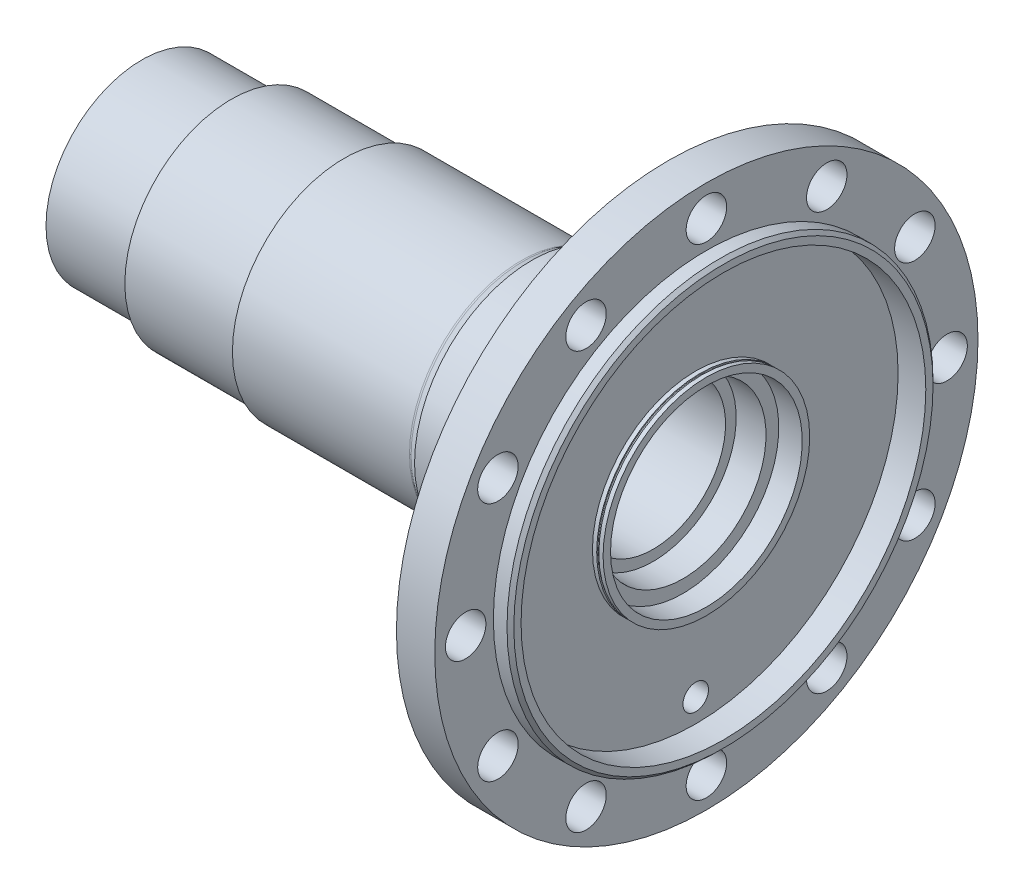
ISO-10303-21;
HEADER;
FILE_DESCRIPTION(('STEP AP214'),'2;1');
FILE_NAME('part.step','',(''),(''),'','','');
FILE_SCHEMA(('AUTOMOTIVE_DESIGN { 1 0 10303 214 1 1 1 1 }'));
ENDSEC;
DATA;
#1=APPLICATION_CONTEXT('core data for automotive mechanical design processes');
#2=APPLICATION_PROTOCOL_DEFINITION('international standard','automotive_design',2000,#1);
#3=PRODUCT_CONTEXT('',#1,'mechanical');
#4=PRODUCT('Part','Part','',(#3));
#5=PRODUCT_RELATED_PRODUCT_CATEGORY('part','',(#4));
#6=PRODUCT_DEFINITION_FORMATION('','',#4);
#7=PRODUCT_DEFINITION_CONTEXT('part definition',#1,'design');
#8=PRODUCT_DEFINITION('design','',#6,#7);
#9=PRODUCT_DEFINITION_SHAPE('','',#8);
#10=(LENGTH_UNIT() NAMED_UNIT(*) SI_UNIT(.MILLI.,.METRE.));
#11=(NAMED_UNIT(*) PLANE_ANGLE_UNIT() SI_UNIT($,.RADIAN.));
#12=(NAMED_UNIT(*) SI_UNIT($,.STERADIAN.) SOLID_ANGLE_UNIT());
#13=UNCERTAINTY_MEASURE_WITH_UNIT(LENGTH_MEASURE(1.E-05),#10,'distance_accuracy_value','');
#14=(GEOMETRIC_REPRESENTATION_CONTEXT(3) GLOBAL_UNCERTAINTY_ASSIGNED_CONTEXT((#13)) GLOBAL_UNIT_ASSIGNED_CONTEXT((#10,
#11,#12)) REPRESENTATION_CONTEXT('',''));
#15=CARTESIAN_POINT('',(0.,0.,0.));
#16=DIRECTION('',(0.,0.,1.));
#17=DIRECTION('',(1.,0.,0.));
#18=AXIS2_PLACEMENT_3D('',#15,#16,#17);
#19=CARTESIAN_POINT('',(265.,45.,0.));
#20=DIRECTION('',(1.,0.,0.));
#21=DIRECTION('',(0.,0.,-1.));
#22=AXIS2_PLACEMENT_3D('',#19,#20,#21);
#23=PLANE('',#22);
#24=CARTESIAN_POINT('',(265.,0.,0.));
#25=DIRECTION('',(-1.,0.,0.));
#26=DIRECTION('',(0.,0.,1.));
#27=AXIS2_PLACEMENT_3D('',#24,#25,#26);
#28=CIRCLE('',#27,45.);
#29=CARTESIAN_POINT('',(265.,0.,45.));
#30=VERTEX_POINT('',#29);
#31=EDGE_CURVE('E220',#30,#30,#28,.T.);
#32=ORIENTED_EDGE('',*,*,#31,.T.);
#33=EDGE_LOOP('',(#32));
#34=FACE_BOUND('',#33,.T.);
#35=CARTESIAN_POINT('',(265.,0.,0.));
#36=DIRECTION('',(-1.,0.,0.));
#37=DIRECTION('',(0.,0.,1.));
#38=AXIS2_PLACEMENT_3D('',#35,#36,#37);
#39=CIRCLE('',#38,48.5);
#40=CARTESIAN_POINT('',(265.,0.,48.5));
#41=VERTEX_POINT('',#40);
#42=EDGE_CURVE('E259',#41,#41,#39,.T.);
#43=ORIENTED_EDGE('',*,*,#42,.F.);
#44=EDGE_LOOP('',(#43));
#45=FACE_BOUND('',#44,.T.);
#46=ADVANCED_FACE('F50',(#34,#45),#23,.T.);
#47=CARTESIAN_POINT('',(0.,0.,0.));
#48=DIRECTION('',(1.,0.,0.));
#49=DIRECTION('',(0.,0.,-1.));
#50=AXIS2_PLACEMENT_3D('',#47,#48,#49);
#51=PLANE('',#50);
#52=CARTESIAN_POINT('',(0.,0.,0.));
#53=DIRECTION('',(-1.,0.,0.));
#54=DIRECTION('',(0.,0.,1.));
#55=AXIS2_PLACEMENT_3D('',#52,#53,#54);
#56=CIRCLE('',#55,31.);
#57=CARTESIAN_POINT('',(0.,0.,31.));
#58=VERTEX_POINT('',#57);
#59=EDGE_CURVE('E181',#58,#58,#56,.T.);
#60=ORIENTED_EDGE('',*,*,#59,.F.);
#61=EDGE_LOOP('',(#60));
#62=FACE_BOUND('',#61,.T.);
#63=CARTESIAN_POINT('',(0.,0.,0.));
#64=DIRECTION('',(-1.,0.,0.));
#65=DIRECTION('',(0.,0.,1.));
#66=AXIS2_PLACEMENT_3D('',#63,#64,#65);
#67=CIRCLE('',#66,45.);
#68=CARTESIAN_POINT('',(0.,0.,45.));
#69=VERTEX_POINT('',#68);
#70=EDGE_CURVE('E176',#69,#69,#67,.T.);
#71=ORIENTED_EDGE('',*,*,#70,.T.);
#72=EDGE_LOOP('',(#71));
#73=FACE_BOUND('',#72,.T.);
#74=ADVANCED_FACE('F53',(#62,#73),#51,.F.);
#75=CARTESIAN_POINT('',(273.,98.4,0.));
#76=DIRECTION('',(-1.,0.,0.));
#77=DIRECTION('',(0.,0.,1.));
#78=AXIS2_PLACEMENT_3D('',#75,#76,#77);
#79=PLANE('',#78);
#80=CARTESIAN_POINT('',(273.,0.,0.));
#81=DIRECTION('',(-1.,0.,0.));
#82=DIRECTION('',(0.,0.,1.));
#83=AXIS2_PLACEMENT_3D('',#80,#81,#82);
#84=CIRCLE('',#83,95.);
#85=CARTESIAN_POINT('',(273.,0.,95.));
#86=VERTEX_POINT('',#85);
#87=EDGE_CURVE('E225',#86,#86,#84,.T.);
#88=ORIENTED_EDGE('',*,*,#87,.T.);
#89=EDGE_LOOP('',(#88));
#90=FACE_BOUND('',#89,.T.);
#91=CARTESIAN_POINT('',(273.,0.,0.));
#92=DIRECTION('',(-1.,0.,0.));
#93=DIRECTION('',(0.,0.,1.));
#94=AXIS2_PLACEMENT_3D('',#91,#92,#93);
#95=CIRCLE('',#94,98.4);
#96=CARTESIAN_POINT('',(273.,0.,98.4));
#97=VERTEX_POINT('',#96);
#98=EDGE_CURVE('E11',#97,#97,#95,.T.);
#99=ORIENTED_EDGE('',*,*,#98,.F.);
#100=EDGE_LOOP('',(#99));
#101=FACE_BOUND('',#100,.T.);
#102=ADVANCED_FACE('F352',(#90,#101),#79,.F.);
#103=CARTESIAN_POINT('',(273.,0.,0.));
#104=DIRECTION('',(-1.,0.,0.));
#105=DIRECTION('',(0.,0.,1.));
#106=AXIS2_PLACEMENT_3D('',#103,#104,#105);
#107=CONICAL_SURFACE('',#106,98.4,0.785398163397435);
#108=CARTESIAN_POINT('',(271.4,0.,0.));
#109=DIRECTION('',(-1.,0.,0.));
#110=DIRECTION('',(0.,0.,1.));
#111=AXIS2_PLACEMENT_3D('',#108,#109,#110);
#112=CIRCLE('',#111,100.);
#113=CARTESIAN_POINT('',(271.4,0.,100.));
#114=VERTEX_POINT('',#113);
#115=EDGE_CURVE('E60',#114,#114,#112,.T.);
#116=ORIENTED_EDGE('',*,*,#115,.F.);
#117=EDGE_LOOP('',(#116));
#118=FACE_BOUND('',#117,.T.);
#119=ORIENTED_EDGE('',*,*,#98,.T.);
#120=EDGE_LOOP('',(#119));
#121=FACE_BOUND('',#120,.T.);
#122=ADVANCED_FACE('F491',(#118,#121),#107,.T.);
#123=CARTESIAN_POINT('',(0.,0.,0.));
#124=DIRECTION('',(-1.,0.,0.));
#125=DIRECTION('',(0.,0.,1.));
#126=AXIS2_PLACEMENT_3D('',#123,#124,#125);
#127=CYLINDRICAL_SURFACE('',#126,100.);
#128=CARTESIAN_POINT('',(265.,0.,0.));
#129=DIRECTION('',(-1.,0.,0.));
#130=DIRECTION('',(0.,0.,1.));
#131=AXIS2_PLACEMENT_3D('',#128,#129,#130);
#132=CIRCLE('',#131,100.);
#133=CARTESIAN_POINT('',(265.,0.,100.));
#134=VERTEX_POINT('',#133);
#135=EDGE_CURVE('E66',#134,#134,#132,.T.);
#136=ORIENTED_EDGE('',*,*,#135,.F.);
#137=EDGE_LOOP('',(#136));
#138=FACE_BOUND('',#137,.T.);
#139=ORIENTED_EDGE('',*,*,#115,.T.);
#140=EDGE_LOOP('',(#139));
#141=FACE_BOUND('',#140,.T.);
#142=ADVANCED_FACE('F486',(#138,#141),#127,.T.);
#143=CARTESIAN_POINT('',(265.,127.5,0.));
#144=DIRECTION('',(-1.,0.,0.));
#145=DIRECTION('',(0.,0.,1.));
#146=AXIS2_PLACEMENT_3D('',#143,#144,#145);
#147=PLANE('',#146);
#148=CARTESIAN_POINT('',(265.,97.8608706276416,-56.5));
#149=DIRECTION('',(-1.,0.,0.));
#150=DIRECTION('',(0.,0.,1.));
#151=AXIS2_PLACEMENT_3D('',#148,#149,#150);
#152=CIRCLE('',#151,9.5);
#153=CARTESIAN_POINT('',(265.,97.8608706276416,-47.));
#154=VERTEX_POINT('',#153);
#155=EDGE_CURVE('E318',#154,#154,#152,.F.);
#156=ORIENTED_EDGE('',*,*,#155,.F.);
#157=EDGE_LOOP('',(#156));
#158=FACE_BOUND('',#157,.T.);
#159=CARTESIAN_POINT('',(265.,56.4999999999999,-97.8608706276416));
#160=DIRECTION('',(-1.,0.,0.));
#161=DIRECTION('',(0.,0.,1.));
#162=AXIS2_PLACEMENT_3D('',#159,#160,#161);
#163=CIRCLE('',#162,9.49999999999999);
#164=CARTESIAN_POINT('',(265.,56.4999999999999,-88.3608706276416));
#165=VERTEX_POINT('',#164);
#166=EDGE_CURVE('E313',#165,#165,#163,.F.);
#167=ORIENTED_EDGE('',*,*,#166,.F.);
#168=EDGE_LOOP('',(#167));
#169=FACE_BOUND('',#168,.T.);
#170=CARTESIAN_POINT('',(265.,0.,-113.));
#171=DIRECTION('',(-1.,0.,0.));
#172=DIRECTION('',(0.,0.,1.));
#173=AXIS2_PLACEMENT_3D('',#170,#171,#172);
#174=CIRCLE('',#173,9.49999999999999);
#175=CARTESIAN_POINT('',(265.,0.,-103.5));
#176=VERTEX_POINT('',#175);
#177=EDGE_CURVE('E308',#176,#176,#174,.F.);
#178=ORIENTED_EDGE('',*,*,#177,.F.);
#179=EDGE_LOOP('',(#178));
#180=FACE_BOUND('',#179,.T.);
#181=CARTESIAN_POINT('',(265.,-56.5,-97.8608706276415));
#182=DIRECTION('',(-1.,0.,0.));
#183=DIRECTION('',(0.,0.,1.));
#184=AXIS2_PLACEMENT_3D('',#181,#182,#183);
#185=CIRCLE('',#184,9.49999999999999);
#186=CARTESIAN_POINT('',(265.,-56.5,-88.3608706276415));
#187=VERTEX_POINT('',#186);
#188=EDGE_CURVE('E303',#187,#187,#185,.F.);
#189=ORIENTED_EDGE('',*,*,#188,.F.);
#190=EDGE_LOOP('',(#189));
#191=FACE_BOUND('',#190,.T.);
#192=CARTESIAN_POINT('',(265.,-97.8608706276416,-56.5));
#193=DIRECTION('',(-1.,0.,0.));
#194=DIRECTION('',(0.,0.,1.));
#195=AXIS2_PLACEMENT_3D('',#192,#193,#194);
#196=CIRCLE('',#195,9.5);
#197=CARTESIAN_POINT('',(265.,-97.8608706276416,-47.));
#198=VERTEX_POINT('',#197);
#199=EDGE_CURVE('E298',#198,#198,#196,.F.);
#200=ORIENTED_EDGE('',*,*,#199,.F.);
#201=EDGE_LOOP('',(#200));
#202=FACE_BOUND('',#201,.T.);
#203=CARTESIAN_POINT('',(265.,-113.,0.));
#204=DIRECTION('',(-1.,0.,0.));
#205=DIRECTION('',(0.,0.,1.));
#206=AXIS2_PLACEMENT_3D('',#203,#204,#205);
#207=CIRCLE('',#206,9.5);
#208=CARTESIAN_POINT('',(265.,-113.,9.50000000000002));
#209=VERTEX_POINT('',#208);
#210=EDGE_CURVE('E293',#209,#209,#207,.F.);
#211=ORIENTED_EDGE('',*,*,#210,.F.);
#212=EDGE_LOOP('',(#211));
#213=FACE_BOUND('',#212,.T.);
#214=CARTESIAN_POINT('',(265.,-97.8608706276415,56.5));
#215=DIRECTION('',(-1.,0.,0.));
#216=DIRECTION('',(0.,0.,1.));
#217=AXIS2_PLACEMENT_3D('',#214,#215,#216);
#218=CIRCLE('',#217,9.5);
#219=CARTESIAN_POINT('',(265.,-97.8608706276415,66.0000000000001));
#220=VERTEX_POINT('',#219);
#221=EDGE_CURVE('E288',#220,#220,#218,.F.);
#222=ORIENTED_EDGE('',*,*,#221,.F.);
#223=EDGE_LOOP('',(#222));
#224=FACE_BOUND('',#223,.T.);
#225=CARTESIAN_POINT('',(265.,-56.5,97.8608706276416));
#226=DIRECTION('',(-1.,0.,0.));
#227=DIRECTION('',(0.,0.,1.));
#228=AXIS2_PLACEMENT_3D('',#225,#226,#227);
#229=CIRCLE('',#228,9.49999999999999);
#230=CARTESIAN_POINT('',(265.,-56.5,107.360870627642));
#231=VERTEX_POINT('',#230);
#232=EDGE_CURVE('E283',#231,#231,#229,.F.);
#233=ORIENTED_EDGE('',*,*,#232,.F.);
#234=EDGE_LOOP('',(#233));
#235=FACE_BOUND('',#234,.T.);
#236=CARTESIAN_POINT('',(265.,0.,113.));
#237=DIRECTION('',(-1.,0.,0.));
#238=DIRECTION('',(0.,0.,1.));
#239=AXIS2_PLACEMENT_3D('',#236,#237,#238);
#240=CIRCLE('',#239,9.49999999999999);
#241=CARTESIAN_POINT('',(265.,0.,122.5));
#242=VERTEX_POINT('',#241);
#243=EDGE_CURVE('E278',#242,#242,#240,.F.);
#244=ORIENTED_EDGE('',*,*,#243,.F.);
#245=EDGE_LOOP('',(#244));
#246=FACE_BOUND('',#245,.T.);
#247=CARTESIAN_POINT('',(265.,56.5,97.8608706276416));
#248=DIRECTION('',(-1.,0.,0.));
#249=DIRECTION('',(0.,0.,1.));
#250=AXIS2_PLACEMENT_3D('',#247,#248,#249);
#251=CIRCLE('',#250,9.49999999999999);
#252=CARTESIAN_POINT('',(265.,56.5,107.360870627642));
#253=VERTEX_POINT('',#252);
#254=EDGE_CURVE('E273',#253,#253,#251,.F.);
#255=ORIENTED_EDGE('',*,*,#254,.F.);
#256=EDGE_LOOP('',(#255));
#257=FACE_BOUND('',#256,.T.);
#258=CARTESIAN_POINT('',(265.,97.8608706276416,56.5));
#259=DIRECTION('',(-1.,0.,0.));
#260=DIRECTION('',(0.,0.,1.));
#261=AXIS2_PLACEMENT_3D('',#258,#259,#260);
#262=CIRCLE('',#261,9.5);
#263=CARTESIAN_POINT('',(265.,97.8608706276416,66.));
#264=VERTEX_POINT('',#263);
#265=EDGE_CURVE('E268',#264,#264,#262,.F.);
#266=ORIENTED_EDGE('',*,*,#265,.F.);
#267=EDGE_LOOP('',(#266));
#268=FACE_BOUND('',#267,.T.);
#269=CARTESIAN_POINT('',(265.,113.,0.));
#270=DIRECTION('',(-1.,0.,0.));
#271=DIRECTION('',(0.,0.,1.));
#272=AXIS2_PLACEMENT_3D('',#269,#270,#271);
#273=CIRCLE('',#272,9.5);
#274=CARTESIAN_POINT('',(265.,113.,9.49999999999999));
#275=VERTEX_POINT('',#274);
#276=EDGE_CURVE('E264',#275,#275,#273,.F.);
#277=ORIENTED_EDGE('',*,*,#276,.F.);
#278=EDGE_LOOP('',(#277));
#279=FACE_BOUND('',#278,.T.);
#280=CARTESIAN_POINT('',(265.,0.,0.));
#281=DIRECTION('',(-1.,0.,0.));
#282=DIRECTION('',(0.,0.,1.));
#283=AXIS2_PLACEMENT_3D('',#280,#281,#282);
#284=CIRCLE('',#283,127.5);
#285=CARTESIAN_POINT('',(265.,0.,127.5));
#286=VERTEX_POINT('',#285);
#287=EDGE_CURVE('E83',#286,#286,#284,.T.);
#288=ORIENTED_EDGE('',*,*,#287,.F.);
#289=EDGE_LOOP('',(#288));
#290=FACE_BOUND('',#289,.T.);
#291=ORIENTED_EDGE('',*,*,#135,.T.);
#292=EDGE_LOOP('',(#291));
#293=FACE_BOUND('',#292,.T.);
#294=ADVANCED_FACE('F481',(#158,#169,#180,#191,#202,#213,#224,#235,#246,#257,#268,#279,#290,
#293),#147,.F.);
#295=CARTESIAN_POINT('',(0.,0.,0.));
#296=DIRECTION('',(-1.,0.,0.));
#297=DIRECTION('',(0.,0.,1.));
#298=AXIS2_PLACEMENT_3D('',#295,#296,#297);
#299=CYLINDRICAL_SURFACE('',#298,127.5);
#300=CARTESIAN_POINT('',(247.,0.,0.));
#301=DIRECTION('',(-1.,0.,0.));
#302=DIRECTION('',(0.,0.,1.));
#303=AXIS2_PLACEMENT_3D('',#300,#301,#302);
#304=CIRCLE('',#303,127.5);
#305=CARTESIAN_POINT('',(247.,0.,127.5));
#306=VERTEX_POINT('',#305);
#307=EDGE_CURVE('E88',#306,#306,#304,.T.);
#308=ORIENTED_EDGE('',*,*,#307,.F.);
#309=EDGE_LOOP('',(#308));
#310=FACE_BOUND('',#309,.T.);
#311=ORIENTED_EDGE('',*,*,#287,.T.);
#312=EDGE_LOOP('',(#311));
#313=FACE_BOUND('',#312,.T.);
#314=ADVANCED_FACE('F476',(#310,#313),#299,.T.);
#315=CARTESIAN_POINT('',(247.,100.,0.));
#316=DIRECTION('',(1.,0.,0.));
#317=DIRECTION('',(0.,0.,-1.));
#318=AXIS2_PLACEMENT_3D('',#315,#316,#317);
#319=PLANE('',#318);
#320=CARTESIAN_POINT('',(247.,97.8608706276416,-56.5));
#321=DIRECTION('',(1.,0.,0.));
#322=DIRECTION('',(0.,0.,-1.));
#323=AXIS2_PLACEMENT_3D('',#320,#321,#322);
#324=CIRCLE('',#323,9.5);
#325=CARTESIAN_POINT('',(247.,97.8608706276416,-66.));
#326=VERTEX_POINT('',#325);
#327=EDGE_CURVE('E322',#326,#326,#324,.F.);
#328=ORIENTED_EDGE('',*,*,#327,.F.);
#329=EDGE_LOOP('',(#328));
#330=FACE_BOUND('',#329,.T.);
#331=CARTESIAN_POINT('',(247.,56.4999999999999,-97.8608706276416));
#332=DIRECTION('',(1.,0.,0.));
#333=DIRECTION('',(0.,0.,-1.));
#334=AXIS2_PLACEMENT_3D('',#331,#332,#333);
#335=CIRCLE('',#334,9.49999999999999);
#336=CARTESIAN_POINT('',(247.,56.4999999999999,-107.360870627642));
#337=VERTEX_POINT('',#336);
#338=EDGE_CURVE('E317',#337,#337,#335,.F.);
#339=ORIENTED_EDGE('',*,*,#338,.F.);
#340=EDGE_LOOP('',(#339));
#341=FACE_BOUND('',#340,.T.);
#342=CARTESIAN_POINT('',(247.,0.,-113.));
#343=DIRECTION('',(1.,0.,0.));
#344=DIRECTION('',(0.,0.,-1.));
#345=AXIS2_PLACEMENT_3D('',#342,#343,#344);
#346=CIRCLE('',#345,9.49999999999999);
#347=CARTESIAN_POINT('',(247.,0.,-122.5));
#348=VERTEX_POINT('',#347);
#349=EDGE_CURVE('E312',#348,#348,#346,.F.);
#350=ORIENTED_EDGE('',*,*,#349,.F.);
#351=EDGE_LOOP('',(#350));
#352=FACE_BOUND('',#351,.T.);
#353=CARTESIAN_POINT('',(247.,-56.5,-97.8608706276415));
#354=DIRECTION('',(1.,0.,0.));
#355=DIRECTION('',(0.,0.,-1.));
#356=AXIS2_PLACEMENT_3D('',#353,#354,#355);
#357=CIRCLE('',#356,9.49999999999999);
#358=CARTESIAN_POINT('',(247.,-56.5,-107.360870627642));
#359=VERTEX_POINT('',#358);
#360=EDGE_CURVE('E307',#359,#359,#357,.F.);
#361=ORIENTED_EDGE('',*,*,#360,.F.);
#362=EDGE_LOOP('',(#361));
#363=FACE_BOUND('',#362,.T.);
#364=CARTESIAN_POINT('',(247.,-97.8608706276416,-56.5));
#365=DIRECTION('',(1.,0.,0.));
#366=DIRECTION('',(0.,0.,-1.));
#367=AXIS2_PLACEMENT_3D('',#364,#365,#366);
#368=CIRCLE('',#367,9.5);
#369=CARTESIAN_POINT('',(247.,-97.8608706276416,-66.));
#370=VERTEX_POINT('',#369);
#371=EDGE_CURVE('E302',#370,#370,#368,.F.);
#372=ORIENTED_EDGE('',*,*,#371,.F.);
#373=EDGE_LOOP('',(#372));
#374=FACE_BOUND('',#373,.T.);
#375=CARTESIAN_POINT('',(247.,-113.,0.));
#376=DIRECTION('',(1.,0.,0.));
#377=DIRECTION('',(0.,0.,-1.));
#378=AXIS2_PLACEMENT_3D('',#375,#376,#377);
#379=CIRCLE('',#378,9.5);
#380=CARTESIAN_POINT('',(247.,-113.,-9.49999999999998));
#381=VERTEX_POINT('',#380);
#382=EDGE_CURVE('E297',#381,#381,#379,.F.);
#383=ORIENTED_EDGE('',*,*,#382,.F.);
#384=EDGE_LOOP('',(#383));
#385=FACE_BOUND('',#384,.T.);
#386=CARTESIAN_POINT('',(247.,-97.8608706276415,56.5));
#387=DIRECTION('',(1.,0.,0.));
#388=DIRECTION('',(0.,0.,-1.));
#389=AXIS2_PLACEMENT_3D('',#386,#387,#388);
#390=CIRCLE('',#389,9.5);
#391=CARTESIAN_POINT('',(247.,-97.8608706276415,47.));
#392=VERTEX_POINT('',#391);
#393=EDGE_CURVE('E292',#392,#392,#390,.F.);
#394=ORIENTED_EDGE('',*,*,#393,.F.);
#395=EDGE_LOOP('',(#394));
#396=FACE_BOUND('',#395,.T.);
#397=CARTESIAN_POINT('',(247.,-56.5,97.8608706276416));
#398=DIRECTION('',(1.,0.,0.));
#399=DIRECTION('',(0.,0.,-1.));
#400=AXIS2_PLACEMENT_3D('',#397,#398,#399);
#401=CIRCLE('',#400,9.49999999999999);
#402=CARTESIAN_POINT('',(247.,-56.5,88.3608706276416));
#403=VERTEX_POINT('',#402);
#404=EDGE_CURVE('E287',#403,#403,#401,.F.);
#405=ORIENTED_EDGE('',*,*,#404,.F.);
#406=EDGE_LOOP('',(#405));
#407=FACE_BOUND('',#406,.T.);
#408=CARTESIAN_POINT('',(247.,0.,113.));
#409=DIRECTION('',(1.,0.,0.));
#410=DIRECTION('',(0.,0.,-1.));
#411=AXIS2_PLACEMENT_3D('',#408,#409,#410);
#412=CIRCLE('',#411,9.49999999999999);
#413=CARTESIAN_POINT('',(247.,0.,103.5));
#414=VERTEX_POINT('',#413);
#415=EDGE_CURVE('E282',#414,#414,#412,.F.);
#416=ORIENTED_EDGE('',*,*,#415,.F.);
#417=EDGE_LOOP('',(#416));
#418=FACE_BOUND('',#417,.T.);
#419=CARTESIAN_POINT('',(247.,56.5,97.8608706276416));
#420=DIRECTION('',(1.,0.,0.));
#421=DIRECTION('',(0.,0.,-1.));
#422=AXIS2_PLACEMENT_3D('',#419,#420,#421);
#423=CIRCLE('',#422,9.49999999999999);
#424=CARTESIAN_POINT('',(247.,56.5,88.3608706276416));
#425=VERTEX_POINT('',#424);
#426=EDGE_CURVE('E277',#425,#425,#423,.F.);
#427=ORIENTED_EDGE('',*,*,#426,.F.);
#428=EDGE_LOOP('',(#427));
#429=FACE_BOUND('',#428,.T.);
#430=CARTESIAN_POINT('',(247.,97.8608706276416,56.5));
#431=DIRECTION('',(1.,0.,0.));
#432=DIRECTION('',(0.,0.,-1.));
#433=AXIS2_PLACEMENT_3D('',#430,#431,#432);
#434=CIRCLE('',#433,9.5);
#435=CARTESIAN_POINT('',(247.,97.8608706276416,47.));
#436=VERTEX_POINT('',#435);
#437=EDGE_CURVE('E272',#436,#436,#434,.F.);
#438=ORIENTED_EDGE('',*,*,#437,.F.);
#439=EDGE_LOOP('',(#438));
#440=FACE_BOUND('',#439,.T.);
#441=CARTESIAN_POINT('',(247.,113.,0.));
#442=DIRECTION('',(1.,0.,0.));
#443=DIRECTION('',(0.,0.,-1.));
#444=AXIS2_PLACEMENT_3D('',#441,#442,#443);
#445=CIRCLE('',#444,9.5);
#446=CARTESIAN_POINT('',(247.,113.,-9.50000000000001));
#447=VERTEX_POINT('',#446);
#448=EDGE_CURVE('E72',#447,#447,#445,.F.);
#449=ORIENTED_EDGE('',*,*,#448,.F.);
#450=EDGE_LOOP('',(#449));
#451=FACE_BOUND('',#450,.T.);
#452=CARTESIAN_POINT('',(247.,0.,0.));
#453=DIRECTION('',(-1.,0.,0.));
#454=DIRECTION('',(0.,0.,1.));
#455=AXIS2_PLACEMENT_3D('',#452,#453,#454);
#456=CIRCLE('',#455,100.);
#457=CARTESIAN_POINT('',(247.,0.,100.));
#458=VERTEX_POINT('',#457);
#459=EDGE_CURVE('E93',#458,#458,#456,.T.);
#460=ORIENTED_EDGE('',*,*,#459,.F.);
#461=EDGE_LOOP('',(#460));
#462=FACE_BOUND('',#461,.T.);
#463=ORIENTED_EDGE('',*,*,#307,.T.);
#464=EDGE_LOOP('',(#463));
#465=FACE_BOUND('',#464,.T.);
#466=ADVANCED_FACE('F471',(#330,#341,#352,#363,#374,#385,#396,#407,#418,#429,#440,#451,#462,
#465),#319,.F.);
#467=CARTESIAN_POINT('',(0.,0.,0.));
#468=DIRECTION('',(-1.,0.,0.));
#469=DIRECTION('',(0.,0.,1.));
#470=AXIS2_PLACEMENT_3D('',#467,#468,#469);
#471=CYLINDRICAL_SURFACE('',#470,100.);
#472=CARTESIAN_POINT('',(239.,0.,0.));
#473=DIRECTION('',(-1.,0.,0.));
#474=DIRECTION('',(0.,0.,1.));
#475=AXIS2_PLACEMENT_3D('',#472,#473,#474);
#476=CIRCLE('',#475,100.);
#477=CARTESIAN_POINT('',(239.,0.,100.));
#478=VERTEX_POINT('',#477);
#479=EDGE_CURVE('E101',#478,#478,#476,.T.);
#480=ORIENTED_EDGE('',*,*,#479,.F.);
#481=EDGE_LOOP('',(#480));
#482=FACE_BOUND('',#481,.T.);
#483=ORIENTED_EDGE('',*,*,#459,.T.);
#484=EDGE_LOOP('',(#483));
#485=FACE_BOUND('',#484,.T.);
#486=ADVANCED_FACE('F466',(#482,#485),#471,.T.);
#487=CARTESIAN_POINT('',(239.,64.5,0.));
#488=DIRECTION('',(1.,0.,0.));
#489=DIRECTION('',(0.,0.,-1.));
#490=AXIS2_PLACEMENT_3D('',#487,#488,#489);
#491=PLANE('',#490);
#492=CARTESIAN_POINT('',(239.,-84.,0.));
#493=DIRECTION('',(1.,0.,0.));
#494=DIRECTION('',(0.,0.,-1.));
#495=AXIS2_PLACEMENT_3D('',#492,#493,#494);
#496=CIRCLE('',#495,6.);
#497=CARTESIAN_POINT('',(239.,-84.,-6.));
#498=VERTEX_POINT('',#497);
#499=EDGE_CURVE('E323',#498,#498,#496,.F.);
#500=ORIENTED_EDGE('',*,*,#499,.F.);
#501=EDGE_LOOP('',(#500));
#502=FACE_BOUND('',#501,.T.);
#503=CARTESIAN_POINT('',(239.,0.,0.));
#504=DIRECTION('',(-1.,0.,0.));
#505=DIRECTION('',(0.,0.,1.));
#506=AXIS2_PLACEMENT_3D('',#503,#504,#505);
#507=CIRCLE('',#506,64.5);
#508=CARTESIAN_POINT('',(239.,0.,64.5));
#509=VERTEX_POINT('',#508);
#510=EDGE_CURVE('E105',#509,#509,#507,.T.);
#511=ORIENTED_EDGE('',*,*,#510,.F.);
#512=EDGE_LOOP('',(#511));
#513=FACE_BOUND('',#512,.T.);
#514=ORIENTED_EDGE('',*,*,#479,.T.);
#515=EDGE_LOOP('',(#514));
#516=FACE_BOUND('',#515,.T.);
#517=ADVANCED_FACE('F461',(#502,#513,#516),#491,.F.);
#518=CARTESIAN_POINT('',(237.,0.,0.));
#519=DIRECTION('',(-1.,0.,0.));
#520=DIRECTION('',(0.,0.,1.));
#521=AXIS2_PLACEMENT_3D('',#518,#519,#520);
#522=TOROIDAL_SURFACE('',#521,64.5,1.99999999999997);
#523=CARTESIAN_POINT('',(237.,0.,0.));
#524=DIRECTION('',(-1.,0.,0.));
#525=DIRECTION('',(0.,0.,1.));
#526=AXIS2_PLACEMENT_3D('',#523,#524,#525);
#527=CIRCLE('',#526,62.5);
#528=CARTESIAN_POINT('',(237.,0.,62.5));
#529=VERTEX_POINT('',#528);
#530=EDGE_CURVE('E110',#529,#529,#527,.T.);
#531=ORIENTED_EDGE('',*,*,#530,.F.);
#532=EDGE_LOOP('',(#531));
#533=FACE_BOUND('',#532,.T.);
#534=ORIENTED_EDGE('',*,*,#510,.T.);
#535=EDGE_LOOP('',(#534));
#536=FACE_BOUND('',#535,.T.);
#537=ADVANCED_FACE('F456',(#533,#536),#522,.F.);
#538=CARTESIAN_POINT('',(0.,0.,0.));
#539=DIRECTION('',(-1.,0.,0.));
#540=DIRECTION('',(0.,0.,1.));
#541=AXIS2_PLACEMENT_3D('',#538,#539,#540);
#542=CYLINDRICAL_SURFACE('',#541,62.5);
#543=CARTESIAN_POINT('',(218.,0.,0.));
#544=DIRECTION('',(-1.,0.,0.));
#545=DIRECTION('',(0.,0.,1.));
#546=AXIS2_PLACEMENT_3D('',#543,#544,#545);
#547=CIRCLE('',#546,62.5);
#548=CARTESIAN_POINT('',(218.,0.,62.5));
#549=VERTEX_POINT('',#548);
#550=EDGE_CURVE('E115',#549,#549,#547,.T.);
#551=ORIENTED_EDGE('',*,*,#550,.F.);
#552=EDGE_LOOP('',(#551));
#553=FACE_BOUND('',#552,.T.);
#554=ORIENTED_EDGE('',*,*,#530,.T.);
#555=EDGE_LOOP('',(#554));
#556=FACE_BOUND('',#555,.T.);
#557=ADVANCED_FACE('F451',(#553,#556),#542,.T.);
#558=CARTESIAN_POINT('',(218.,0.,0.));
#559=DIRECTION('',(1.,0.,0.));
#560=DIRECTION('',(0.,0.,-1.));
#561=AXIS2_PLACEMENT_3D('',#558,#559,#560);
#562=CONICAL_SURFACE('',#561,62.5,0.523598775598297);
#563=CARTESIAN_POINT('',(215.,0.,0.));
#564=DIRECTION('',(-1.,0.,0.));
#565=DIRECTION('',(0.,0.,1.));
#566=AXIS2_PLACEMENT_3D('',#563,#564,#565);
#567=CIRCLE('',#566,60.7679491924311);
#568=CARTESIAN_POINT('',(215.,0.,60.7679491924311));
#569=VERTEX_POINT('',#568);
#570=EDGE_CURVE('E123',#569,#569,#567,.T.);
#571=ORIENTED_EDGE('',*,*,#570,.F.);
#572=EDGE_LOOP('',(#571));
#573=FACE_BOUND('',#572,.T.);
#574=ORIENTED_EDGE('',*,*,#550,.T.);
#575=EDGE_LOOP('',(#574));
#576=FACE_BOUND('',#575,.T.);
#577=ADVANCED_FACE('F446',(#573,#576),#562,.T.);
#578=CARTESIAN_POINT('',(215.,57.,0.));
#579=DIRECTION('',(1.,0.,0.));
#580=DIRECTION('',(0.,0.,-1.));
#581=AXIS2_PLACEMENT_3D('',#578,#579,#580);
#582=PLANE('',#581);
#583=CARTESIAN_POINT('',(215.,0.,0.));
#584=DIRECTION('',(-1.,0.,0.));
#585=DIRECTION('',(0.,0.,1.));
#586=AXIS2_PLACEMENT_3D('',#583,#584,#585);
#587=CIRCLE('',#586,57.);
#588=CARTESIAN_POINT('',(215.,0.,57.));
#589=VERTEX_POINT('',#588);
#590=EDGE_CURVE('E127',#589,#589,#587,.T.);
#591=ORIENTED_EDGE('',*,*,#590,.F.);
#592=EDGE_LOOP('',(#591));
#593=FACE_BOUND('',#592,.T.);
#594=ORIENTED_EDGE('',*,*,#570,.T.);
#595=EDGE_LOOP('',(#594));
#596=FACE_BOUND('',#595,.T.);
#597=ADVANCED_FACE('F441',(#593,#596),#582,.F.);
#598=CARTESIAN_POINT('',(213.,0.,0.));
#599=DIRECTION('',(-1.,0.,0.));
#600=DIRECTION('',(0.,0.,1.));
#601=AXIS2_PLACEMENT_3D('',#598,#599,#600);
#602=TOROIDAL_SURFACE('',#601,57.,1.99999999999997);
#603=CARTESIAN_POINT('',(213.,0.,0.));
#604=DIRECTION('',(-1.,0.,0.));
#605=DIRECTION('',(0.,0.,1.));
#606=AXIS2_PLACEMENT_3D('',#603,#604,#605);
#607=CIRCLE('',#606,55.);
#608=CARTESIAN_POINT('',(213.,0.,55.));
#609=VERTEX_POINT('',#608);
#610=EDGE_CURVE('E132',#609,#609,#607,.T.);
#611=ORIENTED_EDGE('',*,*,#610,.F.);
#612=EDGE_LOOP('',(#611));
#613=FACE_BOUND('',#612,.T.);
#614=ORIENTED_EDGE('',*,*,#590,.T.);
#615=EDGE_LOOP('',(#614));
#616=FACE_BOUND('',#615,.T.);
#617=ADVANCED_FACE('F436',(#613,#616),#602,.F.);
#618=CARTESIAN_POINT('',(0.,0.,0.));
#619=DIRECTION('',(-1.,0.,0.));
#620=DIRECTION('',(0.,0.,1.));
#621=AXIS2_PLACEMENT_3D('',#618,#619,#620);
#622=CYLINDRICAL_SURFACE('',#621,55.);
#623=CARTESIAN_POINT('',(183.,0.,0.));
#624=DIRECTION('',(-1.,0.,0.));
#625=DIRECTION('',(0.,0.,1.));
#626=AXIS2_PLACEMENT_3D('',#623,#624,#625);
#627=CIRCLE('',#626,55.);
#628=CARTESIAN_POINT('',(183.,0.,55.));
#629=VERTEX_POINT('',#628);
#630=EDGE_CURVE('E137',#629,#629,#627,.T.);
#631=ORIENTED_EDGE('',*,*,#630,.F.);
#632=EDGE_LOOP('',(#631));
#633=FACE_BOUND('',#632,.T.);
#634=ORIENTED_EDGE('',*,*,#610,.T.);
#635=EDGE_LOOP('',(#634));
#636=FACE_BOUND('',#635,.T.);
#637=ADVANCED_FACE('F431',(#633,#636),#622,.T.);
#638=CARTESIAN_POINT('',(183.,0.,0.));
#639=DIRECTION('',(1.,0.,0.));
#640=DIRECTION('',(0.,0.,-1.));
#641=AXIS2_PLACEMENT_3D('',#638,#639,#640);
#642=CONICAL_SURFACE('',#641,55.,0.5235987755983);
#643=CARTESIAN_POINT('',(179.133974596216,0.,0.));
#644=DIRECTION('',(-1.,0.,0.));
#645=DIRECTION('',(0.,0.,1.));
#646=AXIS2_PLACEMENT_3D('',#643,#644,#645);
#647=CIRCLE('',#646,52.7679491924311);
#648=CARTESIAN_POINT('',(179.133974596216,0.,52.7679491924311));
#649=VERTEX_POINT('',#648);
#650=EDGE_CURVE('E145',#649,#649,#647,.T.);
#651=ORIENTED_EDGE('',*,*,#650,.F.);
#652=EDGE_LOOP('',(#651));
#653=FACE_BOUND('',#652,.T.);
#654=ORIENTED_EDGE('',*,*,#630,.T.);
#655=EDGE_LOOP('',(#654));
#656=FACE_BOUND('',#655,.T.);
#657=ADVANCED_FACE('F426',(#653,#656),#642,.T.);
#658=CARTESIAN_POINT('',(178.133974596216,0.,0.));
#659=DIRECTION('',(-1.,0.,0.));
#660=DIRECTION('',(0.,0.,1.));
#661=AXIS2_PLACEMENT_3D('',#658,#659,#660);
#662=TOROIDAL_SURFACE('',#661,54.4999999999999,1.99999999999991);
#663=CARTESIAN_POINT('',(178.133974596216,0.,0.));
#664=DIRECTION('',(-1.,0.,0.));
#665=DIRECTION('',(0.,0.,1.));
#666=AXIS2_PLACEMENT_3D('',#663,#664,#665);
#667=CIRCLE('',#666,52.5);
#668=CARTESIAN_POINT('',(178.133974596216,0.,52.5));
#669=VERTEX_POINT('',#668);
#670=EDGE_CURVE('E149',#669,#669,#667,.T.);
#671=ORIENTED_EDGE('',*,*,#670,.F.);
#672=EDGE_LOOP('',(#671));
#673=FACE_BOUND('',#672,.T.);
#674=ORIENTED_EDGE('',*,*,#650,.T.);
#675=EDGE_LOOP('',(#674));
#676=FACE_BOUND('',#675,.T.);
#677=ADVANCED_FACE('F421',(#673,#676),#662,.F.);
#678=CARTESIAN_POINT('',(0.,0.,0.));
#679=DIRECTION('',(-1.,0.,0.));
#680=DIRECTION('',(0.,0.,1.));
#681=AXIS2_PLACEMENT_3D('',#678,#679,#680);
#682=CYLINDRICAL_SURFACE('',#681,52.5);
#683=CARTESIAN_POINT('',(95.,0.,0.));
#684=DIRECTION('',(-1.,0.,0.));
#685=DIRECTION('',(0.,0.,1.));
#686=AXIS2_PLACEMENT_3D('',#683,#684,#685);
#687=CIRCLE('',#686,52.5);
#688=CARTESIAN_POINT('',(95.,0.,52.5));
#689=VERTEX_POINT('',#688);
#690=EDGE_CURVE('E154',#689,#689,#687,.T.);
#691=ORIENTED_EDGE('',*,*,#690,.F.);
#692=EDGE_LOOP('',(#691));
#693=FACE_BOUND('',#692,.T.);
#694=ORIENTED_EDGE('',*,*,#670,.T.);
#695=EDGE_LOOP('',(#694));
#696=FACE_BOUND('',#695,.T.);
#697=ADVANCED_FACE('F416',(#693,#696),#682,.T.);
#698=CARTESIAN_POINT('',(95.,50.,0.));
#699=DIRECTION('',(1.,0.,0.));
#700=DIRECTION('',(0.,0.,-1.));
#701=AXIS2_PLACEMENT_3D('',#698,#699,#700);
#702=PLANE('',#701);
#703=CARTESIAN_POINT('',(95.,0.,0.));
#704=DIRECTION('',(-1.,0.,0.));
#705=DIRECTION('',(0.,0.,1.));
#706=AXIS2_PLACEMENT_3D('',#703,#704,#705);
#707=CIRCLE('',#706,50.);
#708=CARTESIAN_POINT('',(95.,0.,50.));
#709=VERTEX_POINT('',#708);
#710=EDGE_CURVE('E159',#709,#709,#707,.T.);
#711=ORIENTED_EDGE('',*,*,#710,.F.);
#712=EDGE_LOOP('',(#711));
#713=FACE_BOUND('',#712,.T.);
#714=ORIENTED_EDGE('',*,*,#690,.T.);
#715=EDGE_LOOP('',(#714));
#716=FACE_BOUND('',#715,.T.);
#717=ADVANCED_FACE('F411',(#713,#716),#702,.F.);
#718=CARTESIAN_POINT('',(0.,0.,0.));
#719=DIRECTION('',(-1.,0.,0.));
#720=DIRECTION('',(0.,0.,1.));
#721=AXIS2_PLACEMENT_3D('',#718,#719,#720);
#722=CYLINDRICAL_SURFACE('',#721,50.);
#723=CARTESIAN_POINT('',(42.,0.,0.));
#724=DIRECTION('',(-1.,0.,0.));
#725=DIRECTION('',(0.,0.,1.));
#726=AXIS2_PLACEMENT_3D('',#723,#724,#725);
#727=CIRCLE('',#726,50.);
#728=CARTESIAN_POINT('',(42.,0.,50.));
#729=VERTEX_POINT('',#728);
#730=EDGE_CURVE('E167',#729,#729,#727,.T.);
#731=ORIENTED_EDGE('',*,*,#730,.F.);
#732=EDGE_LOOP('',(#731));
#733=FACE_BOUND('',#732,.T.);
#734=ORIENTED_EDGE('',*,*,#710,.T.);
#735=EDGE_LOOP('',(#734));
#736=FACE_BOUND('',#735,.T.);
#737=ADVANCED_FACE('F406',(#733,#736),#722,.T.);
#738=CARTESIAN_POINT('',(42.,45.,0.));
#739=DIRECTION('',(1.,0.,0.));
#740=DIRECTION('',(0.,0.,-1.));
#741=AXIS2_PLACEMENT_3D('',#738,#739,#740);
#742=PLANE('',#741);
#743=CARTESIAN_POINT('',(42.,0.,0.));
#744=DIRECTION('',(-1.,0.,0.));
#745=DIRECTION('',(0.,0.,1.));
#746=AXIS2_PLACEMENT_3D('',#743,#744,#745);
#747=CIRCLE('',#746,45.);
#748=CARTESIAN_POINT('',(42.,0.,45.));
#749=VERTEX_POINT('',#748);
#750=EDGE_CURVE('E171',#749,#749,#747,.T.);
#751=ORIENTED_EDGE('',*,*,#750,.F.);
#752=EDGE_LOOP('',(#751));
#753=FACE_BOUND('',#752,.T.);
#754=ORIENTED_EDGE('',*,*,#730,.T.);
#755=EDGE_LOOP('',(#754));
#756=FACE_BOUND('',#755,.T.);
#757=ADVANCED_FACE('F401',(#753,#756),#742,.F.);
#758=CARTESIAN_POINT('',(0.,0.,0.));
#759=DIRECTION('',(-1.,0.,0.));
#760=DIRECTION('',(0.,0.,1.));
#761=AXIS2_PLACEMENT_3D('',#758,#759,#760);
#762=CYLINDRICAL_SURFACE('',#761,45.);
#763=ORIENTED_EDGE('',*,*,#70,.F.);
#764=EDGE_LOOP('',(#763));
#765=FACE_BOUND('',#764,.T.);
#766=ORIENTED_EDGE('',*,*,#750,.T.);
#767=EDGE_LOOP('',(#766));
#768=FACE_BOUND('',#767,.T.);
#769=ADVANCED_FACE('F396',(#765,#768),#762,.T.);
#770=CARTESIAN_POINT('',(0.,0.,0.));
#771=DIRECTION('',(-1.,0.,0.));
#772=DIRECTION('',(0.,0.,1.));
#773=AXIS2_PLACEMENT_3D('',#770,#771,#772);
#774=CYLINDRICAL_SURFACE('',#773,31.);
#775=ORIENTED_EDGE('',*,*,#59,.T.);
#776=EDGE_LOOP('',(#775));
#777=FACE_BOUND('',#776,.T.);
#778=CARTESIAN_POINT('',(203.5,0.,0.));
#779=DIRECTION('',(-1.,0.,0.));
#780=DIRECTION('',(0.,0.,1.));
#781=AXIS2_PLACEMENT_3D('',#778,#779,#780);
#782=CIRCLE('',#781,31.);
#783=CARTESIAN_POINT('',(203.5,0.,31.));
#784=VERTEX_POINT('',#783);
#785=EDGE_CURVE('E189',#784,#784,#782,.T.);
#786=ORIENTED_EDGE('',*,*,#785,.F.);
#787=EDGE_LOOP('',(#786));
#788=FACE_BOUND('',#787,.T.);
#789=ADVANCED_FACE('F391',(#777,#788),#774,.F.);
#790=CARTESIAN_POINT('',(203.5,31.,0.));
#791=DIRECTION('',(1.,0.,0.));
#792=DIRECTION('',(0.,0.,-1.));
#793=AXIS2_PLACEMENT_3D('',#790,#791,#792);
#794=PLANE('',#793);
#795=ORIENTED_EDGE('',*,*,#785,.T.);
#796=EDGE_LOOP('',(#795));
#797=FACE_BOUND('',#796,.T.);
#798=CARTESIAN_POINT('',(203.5,0.,0.));
#799=DIRECTION('',(-1.,0.,0.));
#800=DIRECTION('',(0.,0.,1.));
#801=AXIS2_PLACEMENT_3D('',#798,#799,#800);
#802=CIRCLE('',#801,34.);
#803=CARTESIAN_POINT('',(203.5,0.,34.));
#804=VERTEX_POINT('',#803);
#805=EDGE_CURVE('E193',#804,#804,#802,.T.);
#806=ORIENTED_EDGE('',*,*,#805,.F.);
#807=EDGE_LOOP('',(#806));
#808=FACE_BOUND('',#807,.T.);
#809=ADVANCED_FACE('F386',(#797,#808),#794,.T.);
#810=CARTESIAN_POINT('',(0.,0.,0.));
#811=DIRECTION('',(-1.,0.,0.));
#812=DIRECTION('',(0.,0.,1.));
#813=AXIS2_PLACEMENT_3D('',#810,#811,#812);
#814=CYLINDRICAL_SURFACE('',#813,34.);
#815=ORIENTED_EDGE('',*,*,#805,.T.);
#816=EDGE_LOOP('',(#815));
#817=FACE_BOUND('',#816,.T.);
#818=CARTESIAN_POINT('',(240.,0.,0.));
#819=DIRECTION('',(-1.,0.,0.));
#820=DIRECTION('',(0.,0.,1.));
#821=AXIS2_PLACEMENT_3D('',#818,#819,#820);
#822=CIRCLE('',#821,34.);
#823=CARTESIAN_POINT('',(240.,0.,34.));
#824=VERTEX_POINT('',#823);
#825=EDGE_CURVE('E198',#824,#824,#822,.T.);
#826=ORIENTED_EDGE('',*,*,#825,.F.);
#827=EDGE_LOOP('',(#826));
#828=FACE_BOUND('',#827,.T.);
#829=ADVANCED_FACE('F381',(#817,#828),#814,.F.);
#830=CARTESIAN_POINT('',(240.,34.,0.));
#831=DIRECTION('',(1.,0.,0.));
#832=DIRECTION('',(0.,0.,-1.));
#833=AXIS2_PLACEMENT_3D('',#830,#831,#832);
#834=PLANE('',#833);
#835=ORIENTED_EDGE('',*,*,#825,.T.);
#836=EDGE_LOOP('',(#835));
#837=FACE_BOUND('',#836,.T.);
#838=CARTESIAN_POINT('',(240.,0.,0.));
#839=DIRECTION('',(-1.,0.,0.));
#840=DIRECTION('',(0.,0.,1.));
#841=AXIS2_PLACEMENT_3D('',#838,#839,#840);
#842=CIRCLE('',#841,39.);
#843=CARTESIAN_POINT('',(240.,0.,39.));
#844=VERTEX_POINT('',#843);
#845=EDGE_CURVE('E203',#844,#844,#842,.T.);
#846=ORIENTED_EDGE('',*,*,#845,.F.);
#847=EDGE_LOOP('',(#846));
#848=FACE_BOUND('',#847,.T.);
#849=ADVANCED_FACE('F376',(#837,#848),#834,.T.);
#850=CARTESIAN_POINT('',(0.,0.,0.));
#851=DIRECTION('',(-1.,0.,0.));
#852=DIRECTION('',(0.,0.,1.));
#853=AXIS2_PLACEMENT_3D('',#850,#851,#852);
#854=CYLINDRICAL_SURFACE('',#853,39.);
#855=ORIENTED_EDGE('',*,*,#845,.T.);
#856=EDGE_LOOP('',(#855));
#857=FACE_BOUND('',#856,.T.);
#858=CARTESIAN_POINT('',(254.,0.,0.));
#859=DIRECTION('',(-1.,0.,0.));
#860=DIRECTION('',(0.,0.,1.));
#861=AXIS2_PLACEMENT_3D('',#858,#859,#860);
#862=CIRCLE('',#861,39.);
#863=CARTESIAN_POINT('',(254.,0.,39.));
#864=VERTEX_POINT('',#863);
#865=EDGE_CURVE('E211',#864,#864,#862,.T.);
#866=ORIENTED_EDGE('',*,*,#865,.F.);
#867=EDGE_LOOP('',(#866));
#868=FACE_BOUND('',#867,.T.);
#869=ADVANCED_FACE('F371',(#857,#868),#854,.F.);
#870=CARTESIAN_POINT('',(254.,39.,0.));
#871=DIRECTION('',(1.,0.,0.));
#872=DIRECTION('',(0.,0.,-1.));
#873=AXIS2_PLACEMENT_3D('',#870,#871,#872);
#874=PLANE('',#873);
#875=ORIENTED_EDGE('',*,*,#865,.T.);
#876=EDGE_LOOP('',(#875));
#877=FACE_BOUND('',#876,.T.);
#878=CARTESIAN_POINT('',(254.,0.,0.));
#879=DIRECTION('',(-1.,0.,0.));
#880=DIRECTION('',(0.,0.,1.));
#881=AXIS2_PLACEMENT_3D('',#878,#879,#880);
#882=CIRCLE('',#881,45.);
#883=CARTESIAN_POINT('',(254.,0.,45.));
#884=VERTEX_POINT('',#883);
#885=EDGE_CURVE('E215',#884,#884,#882,.T.);
#886=ORIENTED_EDGE('',*,*,#885,.F.);
#887=EDGE_LOOP('',(#886));
#888=FACE_BOUND('',#887,.T.);
#889=ADVANCED_FACE('F366',(#877,#888),#874,.T.);
#890=CARTESIAN_POINT('',(0.,0.,0.));
#891=DIRECTION('',(-1.,0.,0.));
#892=DIRECTION('',(0.,0.,1.));
#893=AXIS2_PLACEMENT_3D('',#890,#891,#892);
#894=CYLINDRICAL_SURFACE('',#893,45.);
#895=ORIENTED_EDGE('',*,*,#885,.T.);
#896=EDGE_LOOP('',(#895));
#897=FACE_BOUND('',#896,.T.);
#898=ORIENTED_EDGE('',*,*,#31,.F.);
#899=EDGE_LOOP('',(#898));
#900=FACE_BOUND('',#899,.T.);
#901=ADVANCED_FACE('F362',(#897,#900),#894,.F.);
#902=CARTESIAN_POINT('',(0.,0.,0.));
#903=DIRECTION('',(-1.,0.,0.));
#904=DIRECTION('',(0.,0.,1.));
#905=AXIS2_PLACEMENT_3D('',#902,#903,#904);
#906=CYLINDRICAL_SURFACE('',#905,95.);
#907=ORIENTED_EDGE('',*,*,#87,.F.);
#908=EDGE_LOOP('',(#907));
#909=FACE_BOUND('',#908,.T.);
#910=CARTESIAN_POINT('',(260.,0.,0.));
#911=DIRECTION('',(-1.,0.,0.));
#912=DIRECTION('',(0.,0.,1.));
#913=AXIS2_PLACEMENT_3D('',#910,#911,#912);
#914=CIRCLE('',#913,95.);
#915=CARTESIAN_POINT('',(260.,0.,95.));
#916=VERTEX_POINT('',#915);
#917=EDGE_CURVE('E237',#916,#916,#914,.T.);
#918=ORIENTED_EDGE('',*,*,#917,.T.);
#919=EDGE_LOOP('',(#918));
#920=FACE_BOUND('',#919,.T.);
#921=ADVANCED_FACE('F359',(#909,#920),#906,.F.);
#922=CARTESIAN_POINT('',(0.,0.,0.));
#923=DIRECTION('',(-1.,0.,0.));
#924=DIRECTION('',(0.,0.,1.));
#925=AXIS2_PLACEMENT_3D('',#922,#923,#924);
#926=CYLINDRICAL_SURFACE('',#925,48.5);
#927=ORIENTED_EDGE('',*,*,#42,.T.);
#928=EDGE_LOOP('',(#927));
#929=FACE_BOUND('',#928,.T.);
#930=CARTESIAN_POINT('',(263.,0.,0.));
#931=DIRECTION('',(-1.,0.,0.));
#932=DIRECTION('',(0.,0.,1.));
#933=AXIS2_PLACEMENT_3D('',#930,#931,#932);
#934=CIRCLE('',#933,48.5);
#935=CARTESIAN_POINT('',(263.,0.,48.5));
#936=VERTEX_POINT('',#935);
#937=EDGE_CURVE('E255',#936,#936,#934,.T.);
#938=ORIENTED_EDGE('',*,*,#937,.F.);
#939=EDGE_LOOP('',(#938));
#940=FACE_BOUND('',#939,.T.);
#941=ADVANCED_FACE('F655',(#929,#940),#926,.T.);
#942=CARTESIAN_POINT('',(263.,48.,0.));
#943=DIRECTION('',(-1.,0.,0.));
#944=DIRECTION('',(0.,0.,1.));
#945=AXIS2_PLACEMENT_3D('',#942,#943,#944);
#946=PLANE('',#945);
#947=CARTESIAN_POINT('',(263.,0.,0.));
#948=DIRECTION('',(-1.,0.,0.));
#949=DIRECTION('',(0.,0.,1.));
#950=AXIS2_PLACEMENT_3D('',#947,#948,#949);
#951=CIRCLE('',#950,48.);
#952=CARTESIAN_POINT('',(263.,0.,48.));
#953=VERTEX_POINT('',#952);
#954=EDGE_CURVE('E246',#953,#953,#951,.T.);
#955=ORIENTED_EDGE('',*,*,#954,.F.);
#956=EDGE_LOOP('',(#955));
#957=FACE_BOUND('',#956,.T.);
#958=ORIENTED_EDGE('',*,*,#937,.T.);
#959=EDGE_LOOP('',(#958));
#960=FACE_BOUND('',#959,.T.);
#961=ADVANCED_FACE('F658',(#957,#960),#946,.T.);
#962=CARTESIAN_POINT('',(260.,95.,0.));
#963=DIRECTION('',(1.,0.,0.));
#964=DIRECTION('',(0.,0.,-1.));
#965=AXIS2_PLACEMENT_3D('',#962,#963,#964);
#966=PLANE('',#965);
#967=CARTESIAN_POINT('',(260.,-84.,0.));
#968=DIRECTION('',(1.,0.,0.));
#969=DIRECTION('',(0.,0.,-1.));
#970=AXIS2_PLACEMENT_3D('',#967,#968,#969);
#971=CIRCLE('',#970,6.);
#972=CARTESIAN_POINT('',(260.,-84.,-6.));
#973=VERTEX_POINT('',#972);
#974=EDGE_CURVE('E55',#973,#973,#971,.F.);
#975=ORIENTED_EDGE('',*,*,#974,.T.);
#976=EDGE_LOOP('',(#975));
#977=FACE_BOUND('',#976,.T.);
#978=CARTESIAN_POINT('',(260.,0.,0.));
#979=DIRECTION('',(-1.,0.,0.));
#980=DIRECTION('',(0.,0.,1.));
#981=AXIS2_PLACEMENT_3D('',#978,#979,#980);
#982=CIRCLE('',#981,48.5);
#983=CARTESIAN_POINT('',(260.,0.,48.5));
#984=VERTEX_POINT('',#983);
#985=EDGE_CURVE('E233',#984,#984,#982,.T.);
#986=ORIENTED_EDGE('',*,*,#985,.T.);
#987=EDGE_LOOP('',(#986));
#988=FACE_BOUND('',#987,.T.);
#989=ORIENTED_EDGE('',*,*,#917,.F.);
#990=EDGE_LOOP('',(#989));
#991=FACE_BOUND('',#990,.T.);
#992=ADVANCED_FACE('F334',(#977,#988,#991),#966,.T.);
#993=CARTESIAN_POINT('',(0.,0.,0.));
#994=DIRECTION('',(-1.,0.,0.));
#995=DIRECTION('',(0.,0.,1.));
#996=AXIS2_PLACEMENT_3D('',#993,#994,#995);
#997=CYLINDRICAL_SURFACE('',#996,48.5);
#998=CARTESIAN_POINT('',(262.,0.,0.));
#999=DIRECTION('',(1.,0.,0.));
#1000=DIRECTION('',(0.,0.,-1.));
#1001=AXIS2_PLACEMENT_3D('',#998,#999,#1000);
#1002=CIRCLE('',#1001,48.5);
#1003=CARTESIAN_POINT('',(262.,0.,-48.5));
#1004=VERTEX_POINT('',#1003);
#1005=EDGE_CURVE('E242',#1004,#1004,#1002,.F.);
#1006=ORIENTED_EDGE('',*,*,#1005,.T.);
#1007=EDGE_LOOP('',(#1006));
#1008=FACE_BOUND('',#1007,.T.);
#1009=ORIENTED_EDGE('',*,*,#985,.F.);
#1010=EDGE_LOOP('',(#1009));
#1011=FACE_BOUND('',#1010,.T.);
#1012=ADVANCED_FACE('F669',(#1008,#1011),#997,.T.);
#1013=CARTESIAN_POINT('',(262.5,0.,0.));
#1014=DIRECTION('',(-1.,0.,0.));
#1015=DIRECTION('',(0.,0.,1.));
#1016=AXIS2_PLACEMENT_3D('',#1013,#1014,#1015);
#1017=TOROIDAL_SURFACE('',#1016,48.,0.500000000000004);
#1018=ORIENTED_EDGE('',*,*,#954,.T.);
#1019=EDGE_LOOP('',(#1018));
#1020=FACE_BOUND('',#1019,.T.);
#1021=CARTESIAN_POINT('',(262.,0.,0.));
#1022=DIRECTION('',(-1.,0.,0.));
#1023=DIRECTION('',(0.,0.,1.));
#1024=AXIS2_PLACEMENT_3D('',#1021,#1022,#1023);
#1025=CIRCLE('',#1024,48.);
#1026=CARTESIAN_POINT('',(262.,0.,48.));
#1027=VERTEX_POINT('',#1026);
#1028=EDGE_CURVE('E251',#1027,#1027,#1025,.T.);
#1029=ORIENTED_EDGE('',*,*,#1028,.F.);
#1030=EDGE_LOOP('',(#1029));
#1031=FACE_BOUND('',#1030,.T.);
#1032=ADVANCED_FACE('F646',(#1020,#1031),#1017,.F.);
#1033=CARTESIAN_POINT('',(262.,95.,0.));
#1034=DIRECTION('',(1.,0.,0.));
#1035=DIRECTION('',(0.,0.,-1.));
#1036=AXIS2_PLACEMENT_3D('',#1033,#1034,#1035);
#1037=PLANE('',#1036);
#1038=ORIENTED_EDGE('',*,*,#1005,.F.);
#1039=EDGE_LOOP('',(#1038));
#1040=FACE_BOUND('',#1039,.T.);
#1041=ORIENTED_EDGE('',*,*,#1028,.T.);
#1042=EDGE_LOOP('',(#1041));
#1043=FACE_BOUND('',#1042,.T.);
#1044=ADVANCED_FACE('F636',(#1040,#1043),#1037,.T.);
#1045=CARTESIAN_POINT('',(273.,113.,0.));
#1046=DIRECTION('',(-1.,0.,0.));
#1047=DIRECTION('',(0.,0.,1.));
#1048=AXIS2_PLACEMENT_3D('',#1045,#1046,#1047);
#1049=CYLINDRICAL_SURFACE('',#1048,9.5);
#1050=ORIENTED_EDGE('',*,*,#448,.T.);
#1051=EDGE_LOOP('',(#1050));
#1052=FACE_BOUND('',#1051,.T.);
#1053=ORIENTED_EDGE('',*,*,#276,.T.);
#1054=EDGE_LOOP('',(#1053));
#1055=FACE_BOUND('',#1054,.T.);
#1056=ADVANCED_FACE('F632',(#1052,#1055),#1049,.F.);
#1057=CARTESIAN_POINT('',(273.,97.8608706276416,56.5));
#1058=DIRECTION('',(-1.,0.,0.));
#1059=DIRECTION('',(0.,0.,1.));
#1060=AXIS2_PLACEMENT_3D('',#1057,#1058,#1059);
#1061=CYLINDRICAL_SURFACE('',#1060,9.5);
#1062=ORIENTED_EDGE('',*,*,#437,.T.);
#1063=EDGE_LOOP('',(#1062));
#1064=FACE_BOUND('',#1063,.T.);
#1065=ORIENTED_EDGE('',*,*,#265,.T.);
#1066=EDGE_LOOP('',(#1065));
#1067=FACE_BOUND('',#1066,.T.);
#1068=ADVANCED_FACE('F635',(#1064,#1067),#1061,.F.);
#1069=CARTESIAN_POINT('',(273.,56.5,97.8608706276416));
#1070=DIRECTION('',(-1.,0.,0.));
#1071=DIRECTION('',(0.,0.,1.));
#1072=AXIS2_PLACEMENT_3D('',#1069,#1070,#1071);
#1073=CYLINDRICAL_SURFACE('',#1072,9.49999999999999);
#1074=ORIENTED_EDGE('',*,*,#426,.T.);
#1075=EDGE_LOOP('',(#1074));
#1076=FACE_BOUND('',#1075,.T.);
#1077=ORIENTED_EDGE('',*,*,#254,.T.);
#1078=EDGE_LOOP('',(#1077));
#1079=FACE_BOUND('',#1078,.T.);
#1080=ADVANCED_FACE('F643',(#1076,#1079),#1073,.F.);
#1081=CARTESIAN_POINT('',(273.,0.,113.));
#1082=DIRECTION('',(-1.,0.,0.));
#1083=DIRECTION('',(0.,0.,1.));
#1084=AXIS2_PLACEMENT_3D('',#1081,#1082,#1083);
#1085=CYLINDRICAL_SURFACE('',#1084,9.49999999999999);
#1086=ORIENTED_EDGE('',*,*,#415,.T.);
#1087=EDGE_LOOP('',(#1086));
#1088=FACE_BOUND('',#1087,.T.);
#1089=ORIENTED_EDGE('',*,*,#243,.T.);
#1090=EDGE_LOOP('',(#1089));
#1091=FACE_BOUND('',#1090,.T.);
#1092=ADVANCED_FACE('F729',(#1088,#1091),#1085,.F.);
#1093=CARTESIAN_POINT('',(273.,-56.5,97.8608706276416));
#1094=DIRECTION('',(-1.,0.,0.));
#1095=DIRECTION('',(0.,0.,1.));
#1096=AXIS2_PLACEMENT_3D('',#1093,#1094,#1095);
#1097=CYLINDRICAL_SURFACE('',#1096,9.49999999999999);
#1098=ORIENTED_EDGE('',*,*,#404,.T.);
#1099=EDGE_LOOP('',(#1098));
#1100=FACE_BOUND('',#1099,.T.);
#1101=ORIENTED_EDGE('',*,*,#232,.T.);
#1102=EDGE_LOOP('',(#1101));
#1103=FACE_BOUND('',#1102,.T.);
#1104=ADVANCED_FACE('F738',(#1100,#1103),#1097,.F.);
#1105=CARTESIAN_POINT('',(273.,-97.8608706276415,56.5));
#1106=DIRECTION('',(-1.,0.,0.));
#1107=DIRECTION('',(0.,0.,1.));
#1108=AXIS2_PLACEMENT_3D('',#1105,#1106,#1107);
#1109=CYLINDRICAL_SURFACE('',#1108,9.5);
#1110=ORIENTED_EDGE('',*,*,#393,.T.);
#1111=EDGE_LOOP('',(#1110));
#1112=FACE_BOUND('',#1111,.T.);
#1113=ORIENTED_EDGE('',*,*,#221,.T.);
#1114=EDGE_LOOP('',(#1113));
#1115=FACE_BOUND('',#1114,.T.);
#1116=ADVANCED_FACE('F748',(#1112,#1115),#1109,.F.);
#1117=CARTESIAN_POINT('',(273.,-113.,0.));
#1118=DIRECTION('',(-1.,0.,0.));
#1119=DIRECTION('',(0.,0.,1.));
#1120=AXIS2_PLACEMENT_3D('',#1117,#1118,#1119);
#1121=CYLINDRICAL_SURFACE('',#1120,9.5);
#1122=ORIENTED_EDGE('',*,*,#382,.T.);
#1123=EDGE_LOOP('',(#1122));
#1124=FACE_BOUND('',#1123,.T.);
#1125=ORIENTED_EDGE('',*,*,#210,.T.);
#1126=EDGE_LOOP('',(#1125));
#1127=FACE_BOUND('',#1126,.T.);
#1128=ADVANCED_FACE('F758',(#1124,#1127),#1121,.F.);
#1129=CARTESIAN_POINT('',(273.,-97.8608706276416,-56.5));
#1130=DIRECTION('',(-1.,0.,0.));
#1131=DIRECTION('',(0.,0.,1.));
#1132=AXIS2_PLACEMENT_3D('',#1129,#1130,#1131);
#1133=CYLINDRICAL_SURFACE('',#1132,9.5);
#1134=ORIENTED_EDGE('',*,*,#371,.T.);
#1135=EDGE_LOOP('',(#1134));
#1136=FACE_BOUND('',#1135,.T.);
#1137=ORIENTED_EDGE('',*,*,#199,.T.);
#1138=EDGE_LOOP('',(#1137));
#1139=FACE_BOUND('',#1138,.T.);
#1140=ADVANCED_FACE('F768',(#1136,#1139),#1133,.F.);
#1141=CARTESIAN_POINT('',(273.,-56.5,-97.8608706276415));
#1142=DIRECTION('',(-1.,0.,0.));
#1143=DIRECTION('',(0.,0.,1.));
#1144=AXIS2_PLACEMENT_3D('',#1141,#1142,#1143);
#1145=CYLINDRICAL_SURFACE('',#1144,9.49999999999999);
#1146=ORIENTED_EDGE('',*,*,#360,.T.);
#1147=EDGE_LOOP('',(#1146));
#1148=FACE_BOUND('',#1147,.T.);
#1149=ORIENTED_EDGE('',*,*,#188,.T.);
#1150=EDGE_LOOP('',(#1149));
#1151=FACE_BOUND('',#1150,.T.);
#1152=ADVANCED_FACE('F778',(#1148,#1151),#1145,.F.);
#1153=CARTESIAN_POINT('',(273.,0.,-113.));
#1154=DIRECTION('',(-1.,0.,0.));
#1155=DIRECTION('',(0.,0.,1.));
#1156=AXIS2_PLACEMENT_3D('',#1153,#1154,#1155);
#1157=CYLINDRICAL_SURFACE('',#1156,9.49999999999999);
#1158=ORIENTED_EDGE('',*,*,#349,.T.);
#1159=EDGE_LOOP('',(#1158));
#1160=FACE_BOUND('',#1159,.T.);
#1161=ORIENTED_EDGE('',*,*,#177,.T.);
#1162=EDGE_LOOP('',(#1161));
#1163=FACE_BOUND('',#1162,.T.);
#1164=ADVANCED_FACE('F788',(#1160,#1163),#1157,.F.);
#1165=CARTESIAN_POINT('',(273.,56.4999999999999,-97.8608706276416));
#1166=DIRECTION('',(-1.,0.,0.));
#1167=DIRECTION('',(0.,0.,1.));
#1168=AXIS2_PLACEMENT_3D('',#1165,#1166,#1167);
#1169=CYLINDRICAL_SURFACE('',#1168,9.49999999999999);
#1170=ORIENTED_EDGE('',*,*,#338,.T.);
#1171=EDGE_LOOP('',(#1170));
#1172=FACE_BOUND('',#1171,.T.);
#1173=ORIENTED_EDGE('',*,*,#166,.T.);
#1174=EDGE_LOOP('',(#1173));
#1175=FACE_BOUND('',#1174,.T.);
#1176=ADVANCED_FACE('F343',(#1172,#1175),#1169,.F.);
#1177=CARTESIAN_POINT('',(273.,97.8608706276416,-56.5));
#1178=DIRECTION('',(-1.,0.,0.));
#1179=DIRECTION('',(0.,0.,1.));
#1180=AXIS2_PLACEMENT_3D('',#1177,#1178,#1179);
#1181=CYLINDRICAL_SURFACE('',#1180,9.5);
#1182=ORIENTED_EDGE('',*,*,#327,.T.);
#1183=EDGE_LOOP('',(#1182));
#1184=FACE_BOUND('',#1183,.T.);
#1185=ORIENTED_EDGE('',*,*,#155,.T.);
#1186=EDGE_LOOP('',(#1185));
#1187=FACE_BOUND('',#1186,.T.);
#1188=ADVANCED_FACE('F339',(#1184,#1187),#1181,.F.);
#1189=CARTESIAN_POINT('',(273.,-84.,0.));
#1190=DIRECTION('',(-1.,0.,0.));
#1191=DIRECTION('',(0.,0.,1.));
#1192=AXIS2_PLACEMENT_3D('',#1189,#1190,#1191);
#1193=CYLINDRICAL_SURFACE('',#1192,6.);
#1194=ORIENTED_EDGE('',*,*,#974,.F.);
#1195=EDGE_LOOP('',(#1194));
#1196=FACE_BOUND('',#1195,.T.);
#1197=ORIENTED_EDGE('',*,*,#499,.T.);
#1198=EDGE_LOOP('',(#1197));
#1199=FACE_BOUND('',#1198,.T.);
#1200=ADVANCED_FACE('F337',(#1196,#1199),#1193,.F.);
#1201=CLOSED_SHELL('',(#46,#74,#102,#122,#142,#294,#314,#466,#486,#517,#537,#557,#577,#597,#617,
#637,#657,#677,#697,#717,#737,#757,#769,#789,#809,#829,#849,#869,#889,#901,#921,#941,#961,#992,
#1012,#1032,#1044,#1056,#1068,#1080,#1092,#1104,#1116,#1128,#1140,#1152,#1164,#1176,#1188,#1200));
#1202=MANIFOLD_SOLID_BREP('B2',#1201);
#1203=ADVANCED_BREP_SHAPE_REPRESENTATION('',(#18,#1202),#14);
#1204=SHAPE_DEFINITION_REPRESENTATION(#9,#1203);
ENDSEC;
END-ISO-10303-21;
